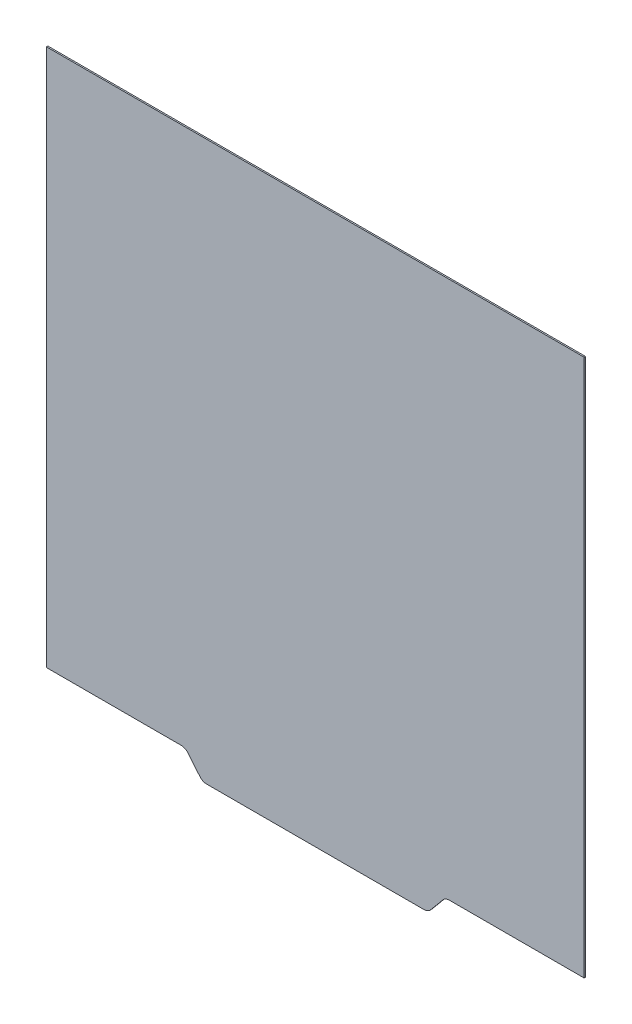
ISO-10303-21;
HEADER;
FILE_DESCRIPTION(('STEP AP214'),'2;1');
FILE_NAME('part.step','',(''),(''),'','','');
FILE_SCHEMA(('AUTOMOTIVE_DESIGN { 1 0 10303 214 1 1 1 1 }'));
ENDSEC;
DATA;
#1=APPLICATION_CONTEXT('core data for automotive mechanical design processes');
#2=APPLICATION_PROTOCOL_DEFINITION('international standard','automotive_design',2000,#1);
#3=PRODUCT_CONTEXT('',#1,'mechanical');
#4=PRODUCT('Part','Part','',(#3));
#5=PRODUCT_RELATED_PRODUCT_CATEGORY('part','',(#4));
#6=PRODUCT_DEFINITION_FORMATION('','',#4);
#7=PRODUCT_DEFINITION_CONTEXT('part definition',#1,'design');
#8=PRODUCT_DEFINITION('design','',#6,#7);
#9=PRODUCT_DEFINITION_SHAPE('','',#8);
#10=(LENGTH_UNIT() NAMED_UNIT(*) SI_UNIT(.MILLI.,.METRE.));
#11=(NAMED_UNIT(*) PLANE_ANGLE_UNIT() SI_UNIT($,.RADIAN.));
#12=(NAMED_UNIT(*) SI_UNIT($,.STERADIAN.) SOLID_ANGLE_UNIT());
#13=UNCERTAINTY_MEASURE_WITH_UNIT(LENGTH_MEASURE(1.E-05),#10,'distance_accuracy_value','');
#14=(GEOMETRIC_REPRESENTATION_CONTEXT(3) GLOBAL_UNCERTAINTY_ASSIGNED_CONTEXT((#13)) GLOBAL_UNIT_ASSIGNED_CONTEXT((#10,
#11,#12)) REPRESENTATION_CONTEXT('',''));
#15=CARTESIAN_POINT('',(0.,0.,0.));
#16=DIRECTION('',(0.,0.,1.));
#17=DIRECTION('',(1.,0.,0.));
#18=AXIS2_PLACEMENT_3D('',#15,#16,#17);
#19=CARTESIAN_POINT('',(0.,-159.538288288288,0.8));
#20=DIRECTION('',(0.,1.,0.));
#21=DIRECTION('',(0.,0.,1.));
#22=AXIS2_PLACEMENT_3D('',#19,#20,#21);
#23=PLANE('',#22);
#24=DIRECTION('',(1.,0.,0.));
#25=VECTOR('',#24,1.);
#26=CARTESIAN_POINT('',(0.,-159.538288288288,0.));
#27=LINE('',#26,#25);
#28=CARTESIAN_POINT('',(-179.087837837838,-159.538288288288,0.));
#29=VERTEX_POINT('',#28);
#30=CARTESIAN_POINT('',(-101.42971256776,-159.538288288288,0.));
#31=VERTEX_POINT('',#30);
#32=EDGE_CURVE('E169',#29,#31,#27,.T.);
#33=ORIENTED_EDGE('',*,*,#32,.T.);
#34=DIRECTION('',(0.,0.,-1.));
#35=VECTOR('',#34,1.);
#36=CARTESIAN_POINT('',(-101.42971256776,-159.538288288288,0.8));
#37=LINE('',#36,#35);
#38=CARTESIAN_POINT('',(-101.42971256776,-159.538288288288,0.8));
#39=VERTEX_POINT('',#38);
#40=EDGE_CURVE('E202',#31,#39,#37,.F.);
#41=ORIENTED_EDGE('',*,*,#40,.T.);
#42=DIRECTION('',(1.,0.,0.));
#43=VECTOR('',#42,1.);
#44=CARTESIAN_POINT('',(0.,-159.538288288288,0.8));
#45=LINE('',#44,#43);
#46=CARTESIAN_POINT('',(-179.087837837838,-159.538288288288,0.8));
#47=VERTEX_POINT('',#46);
#48=EDGE_CURVE('E142',#47,#39,#45,.T.);
#49=ORIENTED_EDGE('',*,*,#48,.F.);
#50=DIRECTION('',(0.,0.,-1.));
#51=VECTOR('',#50,1.);
#52=CARTESIAN_POINT('',(-179.087837837838,-159.538288288288,0.8));
#53=LINE('',#52,#51);
#54=EDGE_CURVE('E168',#47,#29,#53,.T.);
#55=ORIENTED_EDGE('',*,*,#54,.T.);
#56=EDGE_LOOP('',(#33,#41,#49,#55));
#57=FACE_BOUND('',#56,.T.);
#58=ADVANCED_FACE('F41',(#57),#23,.F.);
#59=CARTESIAN_POINT('',(0.,-171.538288288288,0.8));
#60=DIRECTION('',(0.,1.,0.));
#61=DIRECTION('',(0.,0.,1.));
#62=AXIS2_PLACEMENT_3D('',#59,#60,#61);
#63=PLANE('',#62);
#64=DIRECTION('',(1.,0.,0.));
#65=VECTOR('',#64,1.);
#66=CARTESIAN_POINT('',(0.,-171.538288288288,0.8));
#67=LINE('',#66,#65);
#68=CARTESIAN_POINT('',(-86.7459631079156,-171.538288288288,0.8));
#69=VERTEX_POINT('',#68);
#70=CARTESIAN_POINT('',(38.5702874322399,-171.538288288288,0.8));
#71=VERTEX_POINT('',#70);
#72=EDGE_CURVE('E140',#69,#71,#67,.T.);
#73=ORIENTED_EDGE('',*,*,#72,.F.);
#74=DIRECTION('',(0.,0.,-1.));
#75=VECTOR('',#74,1.);
#76=CARTESIAN_POINT('',(-86.7459631079156,-171.538288288288,0.8));
#77=LINE('',#76,#75);
#78=CARTESIAN_POINT('',(-86.7459631079156,-171.538288288288,0.));
#79=VERTEX_POINT('',#78);
#80=EDGE_CURVE('E208',#69,#79,#77,.T.);
#81=ORIENTED_EDGE('',*,*,#80,.T.);
#82=DIRECTION('',(1.,0.,0.));
#83=VECTOR('',#82,1.);
#84=CARTESIAN_POINT('',(0.,-171.538288288288,0.));
#85=LINE('',#84,#83);
#86=CARTESIAN_POINT('',(38.5702874322399,-171.538288288288,0.));
#87=VERTEX_POINT('',#86);
#88=EDGE_CURVE('E173',#79,#87,#85,.T.);
#89=ORIENTED_EDGE('',*,*,#88,.T.);
#90=DIRECTION('',(0.,0.,-1.));
#91=VECTOR('',#90,1.);
#92=CARTESIAN_POINT('',(38.5702874322399,-171.538288288288,0.8));
#93=LINE('',#92,#91);
#94=EDGE_CURVE('E205',#87,#71,#93,.F.);
#95=ORIENTED_EDGE('',*,*,#94,.T.);
#96=EDGE_LOOP('',(#73,#81,#89,#95));
#97=FACE_BOUND('',#96,.T.);
#98=ADVANCED_FACE('F262',(#97),#63,.F.);
#99=CARTESIAN_POINT('',(53.2540368920844,-159.538288288288,0.8));
#100=VERTEX_POINT('',#99);
#101=CARTESIAN_POINT('',(130.912162162162,-159.538288288288,0.8));
#102=VERTEX_POINT('',#101);
#103=EDGE_CURVE('E128',#100,#102,#45,.T.);
#104=ORIENTED_EDGE('',*,*,#103,.F.);
#105=DIRECTION('',(0.,0.,-1.));
#106=VECTOR('',#105,1.);
#107=CARTESIAN_POINT('',(53.2540368920844,-159.538288288288,0.));
#108=LINE('',#107,#106);
#109=CARTESIAN_POINT('',(53.2540368920844,-159.538288288288,0.));
#110=VERTEX_POINT('',#109);
#111=EDGE_CURVE('E224',#100,#110,#108,.T.);
#112=ORIENTED_EDGE('',*,*,#111,.T.);
#113=CARTESIAN_POINT('',(130.912162162162,-159.538288288288,0.));
#114=VERTEX_POINT('',#113);
#115=EDGE_CURVE('E147',#110,#114,#27,.T.);
#116=ORIENTED_EDGE('',*,*,#115,.T.);
#117=DIRECTION('',(0.,0.,-1.));
#118=VECTOR('',#117,1.);
#119=CARTESIAN_POINT('',(130.912162162162,-159.538288288288,0.8));
#120=LINE('',#119,#118);
#121=EDGE_CURVE('E144',#102,#114,#120,.T.);
#122=ORIENTED_EDGE('',*,*,#121,.F.);
#123=EDGE_LOOP('',(#104,#112,#116,#122));
#124=FACE_BOUND('',#123,.T.);
#125=ADVANCED_FACE('F145',(#124),#23,.F.);
#126=CARTESIAN_POINT('',(130.912162162162,0.,0.8));
#127=DIRECTION('',(-1.,0.,0.));
#128=DIRECTION('',(0.,0.,1.));
#129=AXIS2_PLACEMENT_3D('',#126,#127,#128);
#130=PLANE('',#129);
#131=DIRECTION('',(0.,1.,0.));
#132=VECTOR('',#131,1.);
#133=CARTESIAN_POINT('',(130.912162162162,0.,0.));
#134=LINE('',#133,#132);
#135=CARTESIAN_POINT('',(130.912162162162,150.461711711712,0.));
#136=VERTEX_POINT('',#135);
#137=EDGE_CURVE('E178',#114,#136,#134,.T.);
#138=ORIENTED_EDGE('',*,*,#137,.T.);
#139=DIRECTION('',(0.,0.,-1.));
#140=VECTOR('',#139,1.);
#141=CARTESIAN_POINT('',(130.912162162162,150.461711711712,0.8));
#142=LINE('',#141,#140);
#143=CARTESIAN_POINT('',(130.912162162162,150.461711711712,0.8));
#144=VERTEX_POINT('',#143);
#145=EDGE_CURVE('E153',#144,#136,#142,.T.);
#146=ORIENTED_EDGE('',*,*,#145,.F.);
#147=DIRECTION('',(0.,1.,0.));
#148=VECTOR('',#147,1.);
#149=CARTESIAN_POINT('',(130.912162162162,0.,0.8));
#150=LINE('',#149,#148);
#151=EDGE_CURVE('E134',#102,#144,#150,.T.);
#152=ORIENTED_EDGE('',*,*,#151,.F.);
#153=ORIENTED_EDGE('',*,*,#121,.T.);
#154=EDGE_LOOP('',(#138,#146,#152,#153));
#155=FACE_BOUND('',#154,.T.);
#156=ADVANCED_FACE('F155',(#155),#130,.F.);
#157=CARTESIAN_POINT('',(0.,150.461711711712,0.8));
#158=DIRECTION('',(0.,1.,0.));
#159=DIRECTION('',(-1.,0.,0.));
#160=AXIS2_PLACEMENT_3D('',#157,#158,#159);
#161=PLANE('',#160);
#162=DIRECTION('',(1.,0.,0.));
#163=VECTOR('',#162,1.);
#164=CARTESIAN_POINT('',(0.,150.461711711712,0.));
#165=LINE('',#164,#163);
#166=CARTESIAN_POINT('',(-179.087837837838,150.461711711712,0.));
#167=VERTEX_POINT('',#166);
#168=EDGE_CURVE('E181',#167,#136,#165,.T.);
#169=ORIENTED_EDGE('',*,*,#168,.F.);
#170=DIRECTION('',(0.,0.,-1.));
#171=VECTOR('',#170,1.);
#172=CARTESIAN_POINT('',(-179.087837837838,150.461711711712,0.8));
#173=LINE('',#172,#171);
#174=CARTESIAN_POINT('',(-179.087837837838,150.461711711712,0.8));
#175=VERTEX_POINT('',#174);
#176=EDGE_CURVE('E191',#175,#167,#173,.T.);
#177=ORIENTED_EDGE('',*,*,#176,.F.);
#178=DIRECTION('',(1.,0.,0.));
#179=VECTOR('',#178,1.);
#180=CARTESIAN_POINT('',(0.,150.461711711712,0.8));
#181=LINE('',#180,#179);
#182=EDGE_CURVE('E158',#175,#144,#181,.T.);
#183=ORIENTED_EDGE('',*,*,#182,.T.);
#184=ORIENTED_EDGE('',*,*,#145,.T.);
#185=EDGE_LOOP('',(#169,#177,#183,#184));
#186=FACE_BOUND('',#185,.T.);
#187=ADVANCED_FACE('F275',(#186),#161,.T.);
#188=CARTESIAN_POINT('',(-179.087837837838,0.,0.8));
#189=DIRECTION('',(-1.,0.,0.));
#190=DIRECTION('',(0.,0.,1.));
#191=AXIS2_PLACEMENT_3D('',#188,#189,#190);
#192=PLANE('',#191);
#193=DIRECTION('',(0.,1.,0.));
#194=VECTOR('',#193,1.);
#195=CARTESIAN_POINT('',(-179.087837837838,0.,0.));
#196=LINE('',#195,#194);
#197=EDGE_CURVE('E185',#29,#167,#196,.T.);
#198=ORIENTED_EDGE('',*,*,#197,.F.);
#199=ORIENTED_EDGE('',*,*,#54,.F.);
#200=DIRECTION('',(0.,1.,0.));
#201=VECTOR('',#200,1.);
#202=CARTESIAN_POINT('',(-179.087837837838,0.,0.8));
#203=LINE('',#202,#201);
#204=EDGE_CURVE('E161',#47,#175,#203,.T.);
#205=ORIENTED_EDGE('',*,*,#204,.T.);
#206=ORIENTED_EDGE('',*,*,#176,.T.);
#207=EDGE_LOOP('',(#198,#199,#205,#206));
#208=FACE_BOUND('',#207,.T.);
#209=ADVANCED_FACE('F279',(#208),#192,.T.);
#210=CARTESIAN_POINT('',(0.,0.,0.8));
#211=DIRECTION('',(0.,0.,1.));
#212=DIRECTION('',(1.,0.,0.));
#213=AXIS2_PLACEMENT_3D('',#210,#211,#212);
#214=PLANE('',#213);
#215=DIRECTION('',(0.640184399664479,-0.768221279597376,0.));
#216=VECTOR('',#215,1.);
#217=CARTESIAN_POINT('',(-99.0878378378378,-159.538288288288,0.8));
#218=LINE('',#217,#216);
#219=CARTESIAN_POINT('',(-97.5886061697732,-161.337366289966,0.8));
#220=VERTEX_POINT('',#219);
#221=CARTESIAN_POINT('',(-90.5870695059025,-169.739210286611,0.8));
#222=VERTEX_POINT('',#221);
#223=EDGE_CURVE('E174',#220,#222,#218,.T.);
#224=ORIENTED_EDGE('',*,*,#223,.T.);
#225=CARTESIAN_POINT('',(-86.7459631079156,-166.538288288288,0.8));
#226=DIRECTION('',(0.,0.,1.));
#227=DIRECTION('',(1.,0.,0.));
#228=AXIS2_PLACEMENT_3D('',#225,#226,#227);
#229=CIRCLE('',#228,5.);
#230=EDGE_CURVE('E221',#222,#69,#229,.T.);
#231=ORIENTED_EDGE('',*,*,#230,.T.);
#232=ORIENTED_EDGE('',*,*,#72,.T.);
#233=CARTESIAN_POINT('',(38.5702874322399,-166.538288288288,0.8));
#234=DIRECTION('',(0.,0.,1.));
#235=DIRECTION('',(1.,0.,0.));
#236=AXIS2_PLACEMENT_3D('',#233,#234,#235);
#237=CIRCLE('',#236,5.);
#238=CARTESIAN_POINT('',(42.4113938302268,-169.739210286611,0.8));
#239=VERTEX_POINT('',#238);
#240=EDGE_CURVE('E218',#71,#239,#237,.T.);
#241=ORIENTED_EDGE('',*,*,#240,.T.);
#242=DIRECTION('',(0.64018439966448,0.768221279597376,0.));
#243=VECTOR('',#242,1.);
#244=CARTESIAN_POINT('',(50.9121621621622,-159.538288288288,0.8));
#245=LINE('',#244,#243);
#246=CARTESIAN_POINT('',(49.4129304940975,-161.337366289966,0.8));
#247=VERTEX_POINT('',#246);
#248=EDGE_CURVE('E248',#239,#247,#245,.T.);
#249=ORIENTED_EDGE('',*,*,#248,.T.);
#250=CARTESIAN_POINT('',(53.2540368920844,-164.538288288288,0.8));
#251=DIRECTION('',(0.,0.,1.));
#252=DIRECTION('',(1.,0.,0.));
#253=AXIS2_PLACEMENT_3D('',#250,#251,#252);
#254=CIRCLE('',#253,5.);
#255=EDGE_CURVE('E11',#247,#100,#254,.F.);
#256=ORIENTED_EDGE('',*,*,#255,.T.);
#257=ORIENTED_EDGE('',*,*,#103,.T.);
#258=ORIENTED_EDGE('',*,*,#151,.T.);
#259=ORIENTED_EDGE('',*,*,#182,.F.);
#260=ORIENTED_EDGE('',*,*,#204,.F.);
#261=ORIENTED_EDGE('',*,*,#48,.T.);
#262=CARTESIAN_POINT('',(-101.42971256776,-164.538288288288,0.8));
#263=DIRECTION('',(0.,0.,1.));
#264=DIRECTION('',(1.,0.,0.));
#265=AXIS2_PLACEMENT_3D('',#262,#263,#264);
#266=CIRCLE('',#265,5.);
#267=EDGE_CURVE('E236',#39,#220,#266,.F.);
#268=ORIENTED_EDGE('',*,*,#267,.T.);
#269=EDGE_LOOP('',(#224,#231,#232,#241,#249,#256,#257,#258,#259,#260,#261,#268));
#270=FACE_BOUND('',#269,.T.);
#271=ADVANCED_FACE('F131',(#270),#214,.T.);
#272=CARTESIAN_POINT('',(0.,0.,0.));
#273=DIRECTION('',(0.,0.,1.));
#274=DIRECTION('',(1.,0.,0.));
#275=AXIS2_PLACEMENT_3D('',#272,#273,#274);
#276=PLANE('',#275);
#277=ORIENTED_EDGE('',*,*,#88,.F.);
#278=CARTESIAN_POINT('',(-86.7459631079156,-166.538288288288,0.));
#279=DIRECTION('',(0.,0.,1.));
#280=DIRECTION('',(1.,0.,0.));
#281=AXIS2_PLACEMENT_3D('',#278,#279,#280);
#282=CIRCLE('',#281,5.);
#283=CARTESIAN_POINT('',(-90.5870695059025,-169.739210286611,0.));
#284=VERTEX_POINT('',#283);
#285=EDGE_CURVE('E215',#79,#284,#282,.F.);
#286=ORIENTED_EDGE('',*,*,#285,.T.);
#287=DIRECTION('',(0.640184399664479,-0.768221279597376,0.));
#288=VECTOR('',#287,1.);
#289=CARTESIAN_POINT('',(-99.0878378378378,-159.538288288288,0.));
#290=LINE('',#289,#288);
#291=CARTESIAN_POINT('',(-97.5886061697732,-161.337366289966,0.));
#292=VERTEX_POINT('',#291);
#293=EDGE_CURVE('E307',#292,#284,#290,.T.);
#294=ORIENTED_EDGE('',*,*,#293,.F.);
#295=CARTESIAN_POINT('',(-101.42971256776,-164.538288288288,0.));
#296=DIRECTION('',(0.,0.,1.));
#297=DIRECTION('',(1.,0.,0.));
#298=AXIS2_PLACEMENT_3D('',#295,#296,#297);
#299=CIRCLE('',#298,5.);
#300=EDGE_CURVE('E233',#292,#31,#299,.T.);
#301=ORIENTED_EDGE('',*,*,#300,.T.);
#302=ORIENTED_EDGE('',*,*,#32,.F.);
#303=ORIENTED_EDGE('',*,*,#197,.T.);
#304=ORIENTED_EDGE('',*,*,#168,.T.);
#305=ORIENTED_EDGE('',*,*,#137,.F.);
#306=ORIENTED_EDGE('',*,*,#115,.F.);
#307=CARTESIAN_POINT('',(53.2540368920844,-164.538288288288,0.));
#308=DIRECTION('',(0.,0.,1.));
#309=DIRECTION('',(1.,0.,0.));
#310=AXIS2_PLACEMENT_3D('',#307,#308,#309);
#311=CIRCLE('',#310,5.);
#312=CARTESIAN_POINT('',(49.4129304940975,-161.337366289966,0.));
#313=VERTEX_POINT('',#312);
#314=EDGE_CURVE('E50',#110,#313,#311,.T.);
#315=ORIENTED_EDGE('',*,*,#314,.T.);
#316=DIRECTION('',(0.64018439966448,0.768221279597376,0.));
#317=VECTOR('',#316,1.);
#318=CARTESIAN_POINT('',(50.9121621621622,-159.538288288288,0.));
#319=LINE('',#318,#317);
#320=CARTESIAN_POINT('',(42.4113938302268,-169.739210286611,0.));
#321=VERTEX_POINT('',#320);
#322=EDGE_CURVE('E243',#321,#313,#319,.T.);
#323=ORIENTED_EDGE('',*,*,#322,.F.);
#324=CARTESIAN_POINT('',(38.5702874322399,-166.538288288288,0.));
#325=DIRECTION('',(0.,0.,1.));
#326=DIRECTION('',(1.,0.,0.));
#327=AXIS2_PLACEMENT_3D('',#324,#325,#326);
#328=CIRCLE('',#327,5.);
#329=EDGE_CURVE('E212',#321,#87,#328,.F.);
#330=ORIENTED_EDGE('',*,*,#329,.T.);
#331=EDGE_LOOP('',(#277,#286,#294,#301,#302,#303,#304,#305,#306,#315,#323,#330));
#332=FACE_BOUND('',#331,.T.);
#333=ADVANCED_FACE('F242',(#332),#276,.F.);
#334=CARTESIAN_POINT('',(50.9121621621622,-159.538288288288,0.8));
#335=DIRECTION('',(-0.768221279597376,0.64018439966448,0.));
#336=DIRECTION('',(-0.64018439966448,-0.768221279597376,0.));
#337=AXIS2_PLACEMENT_3D('',#334,#335,#336);
#338=PLANE('',#337);
#339=ORIENTED_EDGE('',*,*,#322,.T.);
#340=DIRECTION('',(0.,0.,-1.));
#341=VECTOR('',#340,1.);
#342=CARTESIAN_POINT('',(49.4129304940975,-161.337366289966,0.8));
#343=LINE('',#342,#341);
#344=EDGE_CURVE('E63',#313,#247,#343,.F.);
#345=ORIENTED_EDGE('',*,*,#344,.T.);
#346=ORIENTED_EDGE('',*,*,#248,.F.);
#347=DIRECTION('',(0.,0.,-1.));
#348=VECTOR('',#347,1.);
#349=CARTESIAN_POINT('',(42.4113938302268,-169.739210286611,0.8));
#350=LINE('',#349,#348);
#351=EDGE_CURVE('E227',#239,#321,#350,.T.);
#352=ORIENTED_EDGE('',*,*,#351,.T.);
#353=EDGE_LOOP('',(#339,#345,#346,#352));
#354=FACE_BOUND('',#353,.T.);
#355=ADVANCED_FACE('F245',(#354),#338,.F.);
#356=CARTESIAN_POINT('',(-99.0878378378378,-159.538288288288,0.8));
#357=DIRECTION('',(0.768221279597376,0.640184399664479,0.));
#358=DIRECTION('',(-0.640184399664479,0.768221279597376,0.));
#359=AXIS2_PLACEMENT_3D('',#356,#357,#358);
#360=PLANE('',#359);
#361=ORIENTED_EDGE('',*,*,#223,.F.);
#362=DIRECTION('',(0.,0.,-1.));
#363=VECTOR('',#362,1.);
#364=CARTESIAN_POINT('',(-97.5886061697732,-161.337366289966,0.));
#365=LINE('',#364,#363);
#366=EDGE_CURVE('E198',#220,#292,#365,.T.);
#367=ORIENTED_EDGE('',*,*,#366,.T.);
#368=ORIENTED_EDGE('',*,*,#293,.T.);
#369=DIRECTION('',(0.,0.,-1.));
#370=VECTOR('',#369,1.);
#371=CARTESIAN_POINT('',(-90.5870695059025,-169.739210286611,0.8));
#372=LINE('',#371,#370);
#373=EDGE_CURVE('E152',#284,#222,#372,.F.);
#374=ORIENTED_EDGE('',*,*,#373,.T.);
#375=EDGE_LOOP('',(#361,#367,#368,#374));
#376=FACE_BOUND('',#375,.T.);
#377=ADVANCED_FACE('F292',(#376),#360,.F.);
#378=CARTESIAN_POINT('',(-101.42971256776,-164.538288288288,0.8));
#379=DIRECTION('',(0.,0.,1.));
#380=DIRECTION('',(1.,0.,0.));
#381=AXIS2_PLACEMENT_3D('',#378,#379,#380);
#382=CYLINDRICAL_SURFACE('',#381,5.);
#383=ORIENTED_EDGE('',*,*,#267,.F.);
#384=ORIENTED_EDGE('',*,*,#40,.F.);
#385=ORIENTED_EDGE('',*,*,#300,.F.);
#386=ORIENTED_EDGE('',*,*,#366,.F.);
#387=EDGE_LOOP('',(#383,#384,#385,#386));
#388=FACE_BOUND('',#387,.T.);
#389=ADVANCED_FACE('F258',(#388),#382,.F.);
#390=CARTESIAN_POINT('',(-86.7459631079156,-166.538288288288,0.8));
#391=DIRECTION('',(0.,0.,-1.));
#392=DIRECTION('',(-1.,0.,0.));
#393=AXIS2_PLACEMENT_3D('',#390,#391,#392);
#394=CYLINDRICAL_SURFACE('',#393,5.);
#395=ORIENTED_EDGE('',*,*,#230,.F.);
#396=ORIENTED_EDGE('',*,*,#373,.F.);
#397=ORIENTED_EDGE('',*,*,#285,.F.);
#398=ORIENTED_EDGE('',*,*,#80,.F.);
#399=EDGE_LOOP('',(#395,#396,#397,#398));
#400=FACE_BOUND('',#399,.T.);
#401=ADVANCED_FACE('F252',(#400),#394,.T.);
#402=CARTESIAN_POINT('',(53.2540368920844,-164.538288288288,0.8));
#403=DIRECTION('',(0.,0.,1.));
#404=DIRECTION('',(1.,0.,0.));
#405=AXIS2_PLACEMENT_3D('',#402,#403,#404);
#406=CYLINDRICAL_SURFACE('',#405,5.);
#407=ORIENTED_EDGE('',*,*,#255,.F.);
#408=ORIENTED_EDGE('',*,*,#344,.F.);
#409=ORIENTED_EDGE('',*,*,#314,.F.);
#410=ORIENTED_EDGE('',*,*,#111,.F.);
#411=EDGE_LOOP('',(#407,#408,#409,#410));
#412=FACE_BOUND('',#411,.T.);
#413=ADVANCED_FACE('F250',(#412),#406,.F.);
#414=CARTESIAN_POINT('',(38.5702874322399,-166.538288288288,0.8));
#415=DIRECTION('',(0.,0.,-1.));
#416=DIRECTION('',(-1.,0.,0.));
#417=AXIS2_PLACEMENT_3D('',#414,#415,#416);
#418=CYLINDRICAL_SURFACE('',#417,5.);
#419=ORIENTED_EDGE('',*,*,#240,.F.);
#420=ORIENTED_EDGE('',*,*,#94,.F.);
#421=ORIENTED_EDGE('',*,*,#329,.F.);
#422=ORIENTED_EDGE('',*,*,#351,.F.);
#423=EDGE_LOOP('',(#419,#420,#421,#422));
#424=FACE_BOUND('',#423,.T.);
#425=ADVANCED_FACE('F43',(#424),#418,.T.);
#426=CLOSED_SHELL('',(#58,#98,#125,#156,#187,#209,#271,#333,#355,#377,#389,#401,#413,#425));
#427=MANIFOLD_SOLID_BREP('B2',#426);
#428=ADVANCED_BREP_SHAPE_REPRESENTATION('',(#18,#427),#14);
#429=SHAPE_DEFINITION_REPRESENTATION(#9,#428);
ENDSEC;
END-ISO-10303-21;
